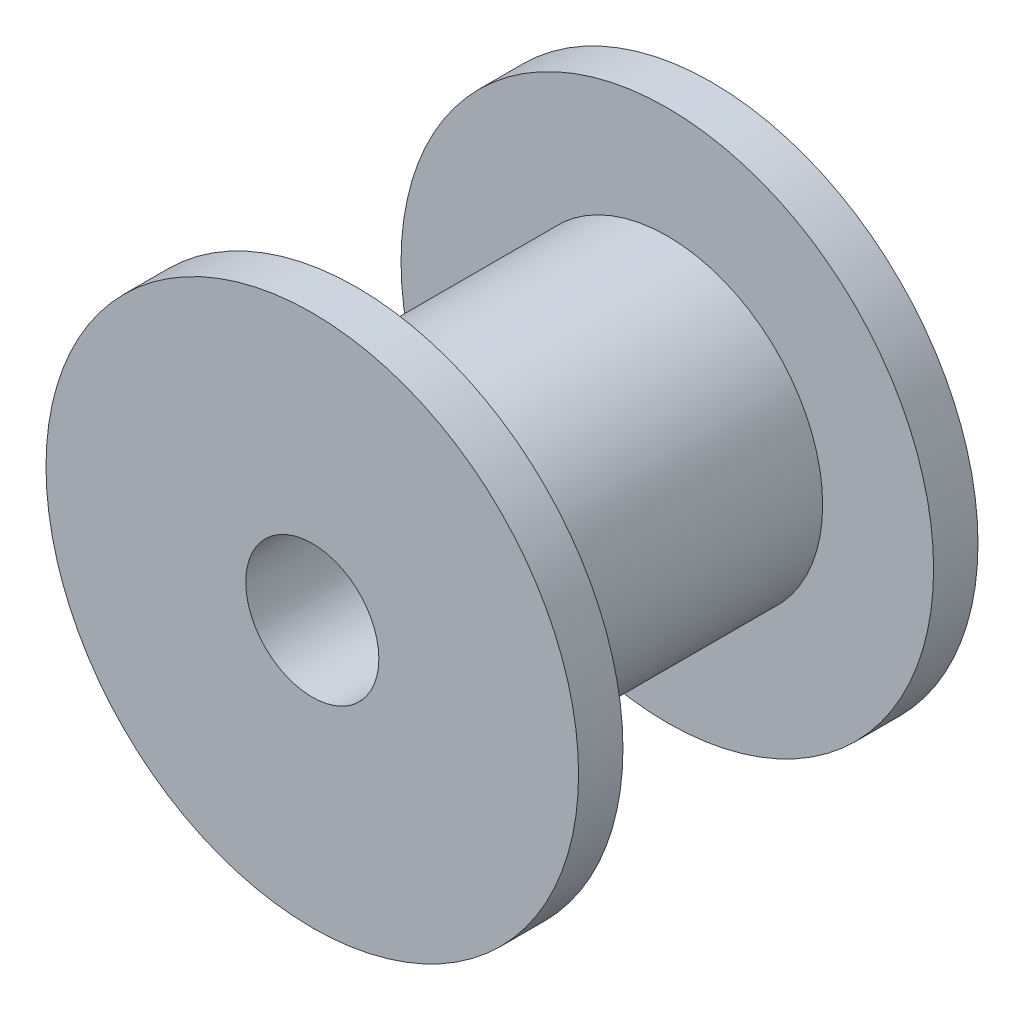
ISO-10303-21;
HEADER;
FILE_DESCRIPTION(('STEP AP214'),'2;1');
FILE_NAME('part.step','',(''),(''),'','','');
FILE_SCHEMA(('AUTOMOTIVE_DESIGN { 1 0 10303 214 1 1 1 1 }'));
ENDSEC;
DATA;
#1=APPLICATION_CONTEXT('core data for automotive mechanical design processes');
#2=APPLICATION_PROTOCOL_DEFINITION('international standard','automotive_design',2000,#1);
#3=PRODUCT_CONTEXT('',#1,'mechanical');
#4=PRODUCT('Part','Part','',(#3));
#5=PRODUCT_RELATED_PRODUCT_CATEGORY('part','',(#4));
#6=PRODUCT_DEFINITION_FORMATION('','',#4);
#7=PRODUCT_DEFINITION_CONTEXT('part definition',#1,'design');
#8=PRODUCT_DEFINITION('design','',#6,#7);
#9=PRODUCT_DEFINITION_SHAPE('','',#8);
#10=(LENGTH_UNIT() NAMED_UNIT(*) SI_UNIT(.MILLI.,.METRE.));
#11=(NAMED_UNIT(*) PLANE_ANGLE_UNIT() SI_UNIT($,.RADIAN.));
#12=(NAMED_UNIT(*) SI_UNIT($,.STERADIAN.) SOLID_ANGLE_UNIT());
#13=UNCERTAINTY_MEASURE_WITH_UNIT(LENGTH_MEASURE(1.E-05),#10,'distance_accuracy_value','');
#14=(GEOMETRIC_REPRESENTATION_CONTEXT(3) GLOBAL_UNCERTAINTY_ASSIGNED_CONTEXT((#13)) GLOBAL_UNIT_ASSIGNED_CONTEXT((#10,
#11,#12)) REPRESENTATION_CONTEXT('',''));
#15=CARTESIAN_POINT('',(0.,0.,0.));
#16=DIRECTION('',(0.,0.,1.));
#17=DIRECTION('',(1.,0.,0.));
#18=AXIS2_PLACEMENT_3D('',#15,#16,#17);
#19=CARTESIAN_POINT('',(0.,0.,9.));
#20=DIRECTION('',(0.,0.,-1.));
#21=DIRECTION('',(-1.,0.,0.));
#22=AXIS2_PLACEMENT_3D('',#19,#20,#21);
#23=CYLINDRICAL_SURFACE('',#22,6.);
#24=CARTESIAN_POINT('',(0.,0.,0.));
#25=DIRECTION('',(0.,0.,1.));
#26=DIRECTION('',(1.,0.,0.));
#27=AXIS2_PLACEMENT_3D('',#24,#25,#26);
#28=CIRCLE('',#27,6.);
#29=CARTESIAN_POINT('',(6.,0.,0.));
#30=VERTEX_POINT('',#29);
#31=EDGE_CURVE('E59',#30,#30,#28,.T.);
#32=ORIENTED_EDGE('',*,*,#31,.T.);
#33=EDGE_LOOP('',(#32));
#34=FACE_BOUND('',#33,.T.);
#35=CARTESIAN_POINT('',(0.,0.,0.999999999999999));
#36=DIRECTION('',(0.,0.,1.));
#37=DIRECTION('',(1.,0.,0.));
#38=AXIS2_PLACEMENT_3D('',#35,#36,#37);
#39=CIRCLE('',#38,6.);
#40=CARTESIAN_POINT('',(6.,0.,0.999999999999999));
#41=VERTEX_POINT('',#40);
#42=EDGE_CURVE('E69',#41,#41,#39,.T.);
#43=ORIENTED_EDGE('',*,*,#42,.F.);
#44=EDGE_LOOP('',(#43));
#45=FACE_BOUND('',#44,.T.);
#46=ADVANCED_FACE('F51',(#34,#45),#23,.T.);
#47=CARTESIAN_POINT('',(0.,0.,9.));
#48=DIRECTION('',(0.,0.,1.));
#49=DIRECTION('',(1.,0.,0.));
#50=AXIS2_PLACEMENT_3D('',#47,#48,#49);
#51=PLANE('',#50);
#52=CARTESIAN_POINT('',(0.,0.,9.));
#53=DIRECTION('',(0.,0.,1.));
#54=DIRECTION('',(1.,0.,0.));
#55=AXIS2_PLACEMENT_3D('',#52,#53,#54);
#56=CIRCLE('',#55,6.);
#57=CARTESIAN_POINT('',(6.,0.,9.));
#58=VERTEX_POINT('',#57);
#59=EDGE_CURVE('E11',#58,#58,#56,.T.);
#60=ORIENTED_EDGE('',*,*,#59,.T.);
#61=EDGE_LOOP('',(#60));
#62=FACE_BOUND('',#61,.T.);
#63=CARTESIAN_POINT('',(0.,0.,9.));
#64=DIRECTION('',(0.,0.,1.));
#65=DIRECTION('',(1.,0.,0.));
#66=AXIS2_PLACEMENT_3D('',#63,#64,#65);
#67=CIRCLE('',#66,1.5);
#68=CARTESIAN_POINT('',(1.5,0.,9.));
#69=VERTEX_POINT('',#68);
#70=EDGE_CURVE('E64',#69,#69,#67,.T.);
#71=ORIENTED_EDGE('',*,*,#70,.F.);
#72=EDGE_LOOP('',(#71));
#73=FACE_BOUND('',#72,.T.);
#74=ADVANCED_FACE('F105',(#62,#73),#51,.T.);
#75=CARTESIAN_POINT('',(0.,0.,0.));
#76=DIRECTION('',(0.,0.,1.));
#77=DIRECTION('',(1.,0.,0.));
#78=AXIS2_PLACEMENT_3D('',#75,#76,#77);
#79=PLANE('',#78);
#80=ORIENTED_EDGE('',*,*,#31,.F.);
#81=EDGE_LOOP('',(#80));
#82=FACE_BOUND('',#81,.T.);
#83=CARTESIAN_POINT('',(0.,0.,0.));
#84=DIRECTION('',(0.,0.,1.));
#85=DIRECTION('',(1.,0.,0.));
#86=AXIS2_PLACEMENT_3D('',#83,#84,#85);
#87=CIRCLE('',#86,1.5);
#88=CARTESIAN_POINT('',(1.5,0.,0.));
#89=VERTEX_POINT('',#88);
#90=EDGE_CURVE('E67',#89,#89,#87,.T.);
#91=ORIENTED_EDGE('',*,*,#90,.T.);
#92=EDGE_LOOP('',(#91));
#93=FACE_BOUND('',#92,.T.);
#94=ADVANCED_FACE('F88',(#82,#93),#79,.F.);
#95=CARTESIAN_POINT('',(0.,0.,8.));
#96=DIRECTION('',(0.,0.,1.));
#97=DIRECTION('',(1.,0.,0.));
#98=AXIS2_PLACEMENT_3D('',#95,#96,#97);
#99=CIRCLE('',#98,6.);
#100=CARTESIAN_POINT('',(6.,0.,8.));
#101=VERTEX_POINT('',#100);
#102=EDGE_CURVE('E55',#101,#101,#99,.T.);
#103=ORIENTED_EDGE('',*,*,#102,.T.);
#104=EDGE_LOOP('',(#103));
#105=FACE_BOUND('',#104,.T.);
#106=ORIENTED_EDGE('',*,*,#59,.F.);
#107=EDGE_LOOP('',(#106));
#108=FACE_BOUND('',#107,.T.);
#109=ADVANCED_FACE('F53',(#105,#108),#23,.T.);
#110=CARTESIAN_POINT('',(0.,0.,9.));
#111=DIRECTION('',(0.,0.,-1.));
#112=DIRECTION('',(-1.,0.,0.));
#113=AXIS2_PLACEMENT_3D('',#110,#111,#112);
#114=CYLINDRICAL_SURFACE('',#113,1.5);
#115=ORIENTED_EDGE('',*,*,#70,.T.);
#116=EDGE_LOOP('',(#115));
#117=FACE_BOUND('',#116,.T.);
#118=ORIENTED_EDGE('',*,*,#90,.F.);
#119=EDGE_LOOP('',(#118));
#120=FACE_BOUND('',#119,.T.);
#121=ADVANCED_FACE('F90',(#117,#120),#114,.F.);
#122=CARTESIAN_POINT('',(0.,0.,8.));
#123=DIRECTION('',(0.,0.,1.));
#124=DIRECTION('',(1.,0.,0.));
#125=AXIS2_PLACEMENT_3D('',#122,#123,#124);
#126=PLANE('',#125);
#127=CARTESIAN_POINT('',(0.,0.,8.));
#128=DIRECTION('',(0.,0.,1.));
#129=DIRECTION('',(1.,0.,0.));
#130=AXIS2_PLACEMENT_3D('',#127,#128,#129);
#131=CIRCLE('',#130,3.5);
#132=CARTESIAN_POINT('',(3.5,0.,8.));
#133=VERTEX_POINT('',#132);
#134=EDGE_CURVE('E71',#133,#133,#131,.T.);
#135=ORIENTED_EDGE('',*,*,#134,.T.);
#136=EDGE_LOOP('',(#135));
#137=FACE_BOUND('',#136,.T.);
#138=ORIENTED_EDGE('',*,*,#102,.F.);
#139=EDGE_LOOP('',(#138));
#140=FACE_BOUND('',#139,.T.);
#141=ADVANCED_FACE('F92',(#137,#140),#126,.F.);
#142=CARTESIAN_POINT('',(0.,0.,1.));
#143=DIRECTION('',(0.,0.,1.));
#144=DIRECTION('',(1.,0.,0.));
#145=AXIS2_PLACEMENT_3D('',#142,#143,#144);
#146=PLANE('',#145);
#147=CARTESIAN_POINT('',(0.,0.,1.));
#148=DIRECTION('',(0.,0.,1.));
#149=DIRECTION('',(1.,0.,0.));
#150=AXIS2_PLACEMENT_3D('',#147,#148,#149);
#151=CIRCLE('',#150,3.5);
#152=CARTESIAN_POINT('',(3.5,0.,1.));
#153=VERTEX_POINT('',#152);
#154=EDGE_CURVE('E76',#153,#153,#151,.T.);
#155=ORIENTED_EDGE('',*,*,#154,.F.);
#156=EDGE_LOOP('',(#155));
#157=FACE_BOUND('',#156,.T.);
#158=ORIENTED_EDGE('',*,*,#42,.T.);
#159=EDGE_LOOP('',(#158));
#160=FACE_BOUND('',#159,.T.);
#161=ADVANCED_FACE('F99',(#157,#160),#146,.T.);
#162=CARTESIAN_POINT('',(0.,0.,8.));
#163=DIRECTION('',(0.,0.,-1.));
#164=DIRECTION('',(-1.,0.,0.));
#165=AXIS2_PLACEMENT_3D('',#162,#163,#164);
#166=CYLINDRICAL_SURFACE('',#165,3.5);
#167=ORIENTED_EDGE('',*,*,#134,.F.);
#168=EDGE_LOOP('',(#167));
#169=FACE_BOUND('',#168,.T.);
#170=ORIENTED_EDGE('',*,*,#154,.T.);
#171=EDGE_LOOP('',(#170));
#172=FACE_BOUND('',#171,.T.);
#173=ADVANCED_FACE('F148',(#169,#172),#166,.T.);
#174=CLOSED_SHELL('',(#46,#74,#94,#109,#121,#141,#161,#173));
#175=MANIFOLD_SOLID_BREP('B2',#174);
#176=ADVANCED_BREP_SHAPE_REPRESENTATION('',(#18,#175),#14);
#177=SHAPE_DEFINITION_REPRESENTATION(#9,#176);
ENDSEC;
END-ISO-10303-21;
